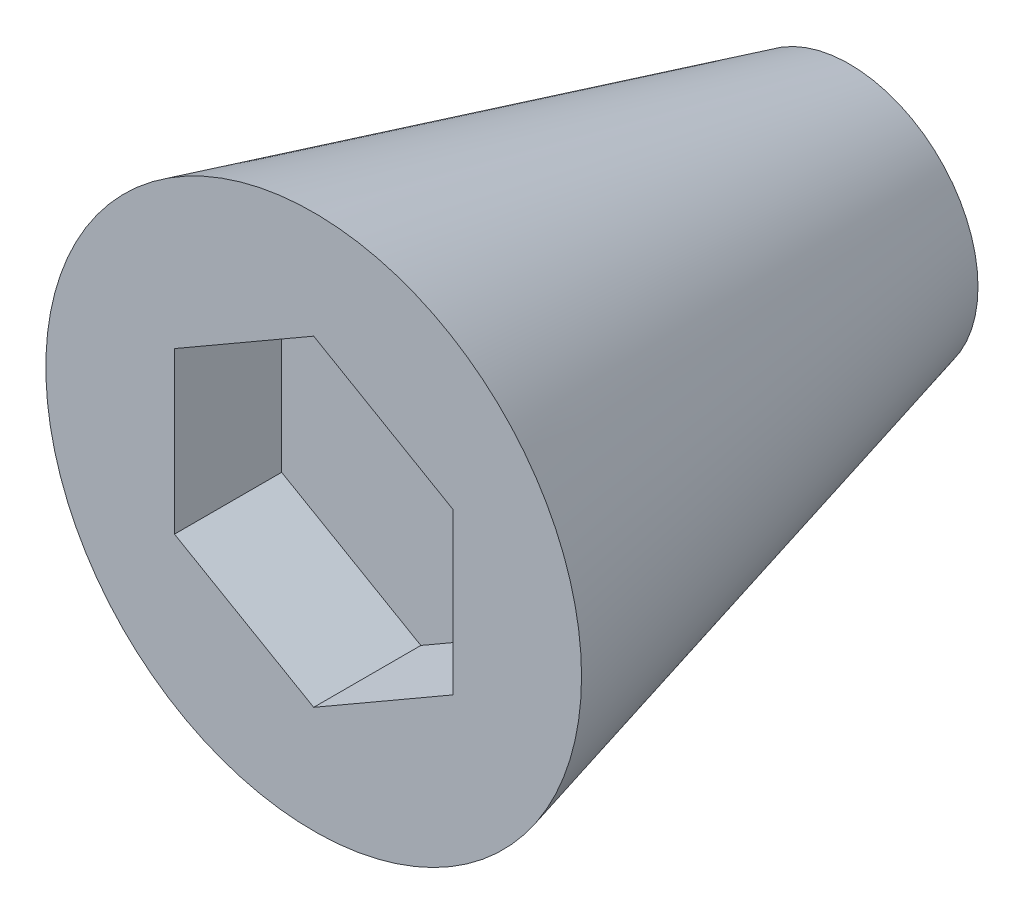
ISO-10303-21;
HEADER;
FILE_DESCRIPTION(('STEP AP214'),'2;1');
FILE_NAME('part.step','',(''),(''),'','','');
FILE_SCHEMA(('AUTOMOTIVE_DESIGN { 1 0 10303 214 1 1 1 1 }'));
ENDSEC;
DATA;
#1=APPLICATION_CONTEXT('core data for automotive mechanical design processes');
#2=APPLICATION_PROTOCOL_DEFINITION('international standard','automotive_design',2000,#1);
#3=PRODUCT_CONTEXT('',#1,'mechanical');
#4=PRODUCT('Part','Part','',(#3));
#5=PRODUCT_RELATED_PRODUCT_CATEGORY('part','',(#4));
#6=PRODUCT_DEFINITION_FORMATION('','',#4);
#7=PRODUCT_DEFINITION_CONTEXT('part definition',#1,'design');
#8=PRODUCT_DEFINITION('design','',#6,#7);
#9=PRODUCT_DEFINITION_SHAPE('','',#8);
#10=(LENGTH_UNIT() NAMED_UNIT(*) SI_UNIT(.MILLI.,.METRE.));
#11=(NAMED_UNIT(*) PLANE_ANGLE_UNIT() SI_UNIT($,.RADIAN.));
#12=(NAMED_UNIT(*) SI_UNIT($,.STERADIAN.) SOLID_ANGLE_UNIT());
#13=UNCERTAINTY_MEASURE_WITH_UNIT(LENGTH_MEASURE(1.E-05),#10,'distance_accuracy_value','');
#14=(GEOMETRIC_REPRESENTATION_CONTEXT(3) GLOBAL_UNCERTAINTY_ASSIGNED_CONTEXT((#13)) GLOBAL_UNIT_ASSIGNED_CONTEXT((#10,
#11,#12)) REPRESENTATION_CONTEXT('',''));
#15=CARTESIAN_POINT('',(0.,0.,0.));
#16=DIRECTION('',(0.,0.,1.));
#17=DIRECTION('',(1.,0.,0.));
#18=AXIS2_PLACEMENT_3D('',#15,#16,#17);
#19=CARTESIAN_POINT('',(0.,0.,0.));
#20=DIRECTION('',(0.,0.,-1.));
#21=DIRECTION('',(-1.,0.,0.));
#22=AXIS2_PLACEMENT_3D('',#19,#20,#21);
#23=PLANE('',#22);
#24=DIRECTION('',(-0.866025403784439,-0.5,0.));
#25=VECTOR('',#24,1.);
#26=CARTESIAN_POINT('',(0.,15.,0.));
#27=LINE('',#26,#25);
#28=CARTESIAN_POINT('',(0.,15.,0.));
#29=VERTEX_POINT('',#28);
#30=CARTESIAN_POINT('',(-12.9903810567666,7.5,0.));
#31=VERTEX_POINT('',#30);
#32=EDGE_CURVE('E169',#29,#31,#27,.T.);
#33=ORIENTED_EDGE('',*,*,#32,.F.);
#34=DIRECTION('',(-0.866025403784439,0.5,0.));
#35=VECTOR('',#34,1.);
#36=CARTESIAN_POINT('',(12.9903810567666,7.50000000000001,0.));
#37=LINE('',#36,#35);
#38=CARTESIAN_POINT('',(12.9903810567666,7.50000000000001,0.));
#39=VERTEX_POINT('',#38);
#40=EDGE_CURVE('E60',#39,#29,#37,.T.);
#41=ORIENTED_EDGE('',*,*,#40,.F.);
#42=DIRECTION('',(0.,1.,0.));
#43=VECTOR('',#42,1.);
#44=CARTESIAN_POINT('',(12.9903810567666,-7.50000000000001,0.));
#45=LINE('',#44,#43);
#46=CARTESIAN_POINT('',(12.9903810567666,-7.50000000000001,0.));
#47=VERTEX_POINT('',#46);
#48=EDGE_CURVE('E155',#47,#39,#45,.T.);
#49=ORIENTED_EDGE('',*,*,#48,.F.);
#50=DIRECTION('',(0.866025403784439,0.5,0.));
#51=VECTOR('',#50,1.);
#52=CARTESIAN_POINT('',(0.,-15.,0.));
#53=LINE('',#52,#51);
#54=CARTESIAN_POINT('',(0.,-15.,0.));
#55=VERTEX_POINT('',#54);
#56=EDGE_CURVE('E158',#55,#47,#53,.T.);
#57=ORIENTED_EDGE('',*,*,#56,.F.);
#58=DIRECTION('',(0.866025403784439,-0.5,0.));
#59=VECTOR('',#58,1.);
#60=CARTESIAN_POINT('',(-12.9903810567666,-7.5,0.));
#61=LINE('',#60,#59);
#62=CARTESIAN_POINT('',(-12.9903810567666,-7.5,0.));
#63=VERTEX_POINT('',#62);
#64=EDGE_CURVE('E174',#63,#55,#61,.T.);
#65=ORIENTED_EDGE('',*,*,#64,.F.);
#66=DIRECTION('',(0.,-1.,0.));
#67=VECTOR('',#66,1.);
#68=CARTESIAN_POINT('',(-12.9903810567666,7.5,0.));
#69=LINE('',#68,#67);
#70=EDGE_CURVE('E171',#31,#63,#69,.T.);
#71=ORIENTED_EDGE('',*,*,#70,.F.);
#72=EDGE_LOOP('',(#33,#41,#49,#57,#65,#71));
#73=FACE_BOUND('',#72,.T.);
#74=CARTESIAN_POINT('',(0.,0.,0.));
#75=DIRECTION('',(0.,0.,1.));
#76=DIRECTION('',(1.,0.,0.));
#77=AXIS2_PLACEMENT_3D('',#74,#75,#76);
#78=CIRCLE('',#77,25.);
#79=CARTESIAN_POINT('',(25.,0.,0.));
#80=VERTEX_POINT('',#79);
#81=EDGE_CURVE('E11',#80,#80,#78,.T.);
#82=ORIENTED_EDGE('',*,*,#81,.T.);
#83=EDGE_LOOP('',(#82));
#84=FACE_BOUND('',#83,.T.);
#85=ADVANCED_FACE('F46',(#73,#84),#23,.F.);
#86=CARTESIAN_POINT('',(0.,0.,-50.));
#87=DIRECTION('',(0.,0.,1.));
#88=DIRECTION('',(1.,0.,0.));
#89=AXIS2_PLACEMENT_3D('',#86,#87,#88);
#90=CONICAL_SURFACE('',#89,12.,0.254368058553266);
#91=ORIENTED_EDGE('',*,*,#81,.F.);
#92=EDGE_LOOP('',(#91));
#93=FACE_BOUND('',#92,.T.);
#94=CARTESIAN_POINT('',(0.,0.,-50.));
#95=DIRECTION('',(0.,0.,1.));
#96=DIRECTION('',(1.,0.,0.));
#97=AXIS2_PLACEMENT_3D('',#94,#95,#96);
#98=CIRCLE('',#97,12.);
#99=CARTESIAN_POINT('',(12.,0.,-50.));
#100=VERTEX_POINT('',#99);
#101=EDGE_CURVE('E53',#100,#100,#98,.T.);
#102=ORIENTED_EDGE('',*,*,#101,.T.);
#103=EDGE_LOOP('',(#102));
#104=FACE_BOUND('',#103,.T.);
#105=ADVANCED_FACE('F236',(#93,#104),#90,.T.);
#106=CARTESIAN_POINT('',(0.,0.,-50.));
#107=DIRECTION('',(0.,0.,1.));
#108=DIRECTION('',(1.,0.,0.));
#109=AXIS2_PLACEMENT_3D('',#106,#107,#108);
#110=PLANE('',#109);
#111=DIRECTION('',(0.866025403784439,-0.5,0.));
#112=VECTOR('',#111,1.);
#113=CARTESIAN_POINT('',(0.,6.92820323027551,-50.));
#114=LINE('',#113,#112);
#115=CARTESIAN_POINT('',(0.,6.92820323027551,-50.));
#116=VERTEX_POINT('',#115);
#117=CARTESIAN_POINT('',(6.,3.46410161513776,-50.));
#118=VERTEX_POINT('',#117);
#119=EDGE_CURVE('E209',#116,#118,#114,.T.);
#120=ORIENTED_EDGE('',*,*,#119,.F.);
#121=DIRECTION('',(0.866025403784439,0.5,0.));
#122=VECTOR('',#121,1.);
#123=CARTESIAN_POINT('',(-6.,3.46410161513776,-50.));
#124=LINE('',#123,#122);
#125=CARTESIAN_POINT('',(-6.,3.46410161513776,-50.));
#126=VERTEX_POINT('',#125);
#127=EDGE_CURVE('E68',#126,#116,#124,.T.);
#128=ORIENTED_EDGE('',*,*,#127,.F.);
#129=DIRECTION('',(0.,1.,0.));
#130=VECTOR('',#129,1.);
#131=CARTESIAN_POINT('',(-6.,-3.46410161513776,-50.));
#132=LINE('',#131,#130);
#133=CARTESIAN_POINT('',(-6.,-3.46410161513776,-50.));
#134=VERTEX_POINT('',#133);
#135=EDGE_CURVE('E192',#134,#126,#132,.T.);
#136=ORIENTED_EDGE('',*,*,#135,.F.);
#137=DIRECTION('',(-0.866025403784439,0.5,0.));
#138=VECTOR('',#137,1.);
#139=CARTESIAN_POINT('',(0.,-6.92820323027551,-50.));
#140=LINE('',#139,#138);
#141=CARTESIAN_POINT('',(0.,-6.92820323027551,-50.));
#142=VERTEX_POINT('',#141);
#143=EDGE_CURVE('E218',#142,#134,#140,.T.);
#144=ORIENTED_EDGE('',*,*,#143,.F.);
#145=DIRECTION('',(-0.866025403784439,-0.5,0.));
#146=VECTOR('',#145,1.);
#147=CARTESIAN_POINT('',(6.,-3.46410161513775,-50.));
#148=LINE('',#147,#146);
#149=CARTESIAN_POINT('',(6.,-3.46410161513775,-50.));
#150=VERTEX_POINT('',#149);
#151=EDGE_CURVE('E215',#150,#142,#148,.T.);
#152=ORIENTED_EDGE('',*,*,#151,.F.);
#153=DIRECTION('',(0.,-1.,0.));
#154=VECTOR('',#153,1.);
#155=CARTESIAN_POINT('',(6.,3.46410161513776,-50.));
#156=LINE('',#155,#154);
#157=EDGE_CURVE('E212',#118,#150,#156,.T.);
#158=ORIENTED_EDGE('',*,*,#157,.F.);
#159=EDGE_LOOP('',(#120,#128,#136,#144,#152,#158));
#160=FACE_BOUND('',#159,.T.);
#161=ORIENTED_EDGE('',*,*,#101,.F.);
#162=EDGE_LOOP('',(#161));
#163=FACE_BOUND('',#162,.T.);
#164=ADVANCED_FACE('F238',(#160,#163),#110,.F.);
#165=CARTESIAN_POINT('',(-6.,3.46410161513776,-45.));
#166=DIRECTION('',(-0.5,0.866025403784439,0.));
#167=DIRECTION('',(-0.866025403784439,-0.5,0.));
#168=AXIS2_PLACEMENT_3D('',#165,#166,#167);
#169=PLANE('',#168);
#170=ORIENTED_EDGE('',*,*,#127,.T.);
#171=DIRECTION('',(0.,0.,-1.));
#172=VECTOR('',#171,1.);
#173=CARTESIAN_POINT('',(0.,6.92820323027551,-45.));
#174=LINE('',#173,#172);
#175=CARTESIAN_POINT('',(0.,6.92820323027551,-45.));
#176=VERTEX_POINT('',#175);
#177=EDGE_CURVE('E207',#176,#116,#174,.T.);
#178=ORIENTED_EDGE('',*,*,#177,.F.);
#179=DIRECTION('',(0.866025403784439,0.5,0.));
#180=VECTOR('',#179,1.);
#181=CARTESIAN_POINT('',(-6.,3.46410161513776,-45.));
#182=LINE('',#181,#180);
#183=CARTESIAN_POINT('',(-6.,3.46410161513776,-45.));
#184=VERTEX_POINT('',#183);
#185=EDGE_CURVE('E188',#184,#176,#182,.T.);
#186=ORIENTED_EDGE('',*,*,#185,.F.);
#187=DIRECTION('',(0.,0.,-1.));
#188=VECTOR('',#187,1.);
#189=CARTESIAN_POINT('',(-6.,3.46410161513776,-45.));
#190=LINE('',#189,#188);
#191=EDGE_CURVE('E223',#184,#126,#190,.T.);
#192=ORIENTED_EDGE('',*,*,#191,.T.);
#193=EDGE_LOOP('',(#170,#178,#186,#192));
#194=FACE_BOUND('',#193,.T.);
#195=ADVANCED_FACE('F240',(#194),#169,.F.);
#196=CARTESIAN_POINT('',(-6.,-3.46410161513776,-45.));
#197=DIRECTION('',(-1.,0.,0.));
#198=DIRECTION('',(0.,0.,1.));
#199=AXIS2_PLACEMENT_3D('',#196,#197,#198);
#200=PLANE('',#199);
#201=ORIENTED_EDGE('',*,*,#135,.T.);
#202=ORIENTED_EDGE('',*,*,#191,.F.);
#203=DIRECTION('',(0.,1.,0.));
#204=VECTOR('',#203,1.);
#205=CARTESIAN_POINT('',(-6.,-3.46410161513776,-45.));
#206=LINE('',#205,#204);
#207=CARTESIAN_POINT('',(-6.,-3.46410161513776,-45.));
#208=VERTEX_POINT('',#207);
#209=EDGE_CURVE('E204',#208,#184,#206,.T.);
#210=ORIENTED_EDGE('',*,*,#209,.F.);
#211=DIRECTION('',(0.,0.,-1.));
#212=VECTOR('',#211,1.);
#213=CARTESIAN_POINT('',(-6.,-3.46410161513776,-45.));
#214=LINE('',#213,#212);
#215=EDGE_CURVE('E225',#208,#134,#214,.T.);
#216=ORIENTED_EDGE('',*,*,#215,.T.);
#217=EDGE_LOOP('',(#201,#202,#210,#216));
#218=FACE_BOUND('',#217,.T.);
#219=ADVANCED_FACE('F247',(#218),#200,.F.);
#220=CARTESIAN_POINT('',(0.,-6.92820323027551,-45.));
#221=DIRECTION('',(-0.5,-0.866025403784439,0.));
#222=DIRECTION('',(0.866025403784439,-0.5,0.));
#223=AXIS2_PLACEMENT_3D('',#220,#221,#222);
#224=PLANE('',#223);
#225=ORIENTED_EDGE('',*,*,#143,.T.);
#226=ORIENTED_EDGE('',*,*,#215,.F.);
#227=DIRECTION('',(-0.866025403784439,0.5,0.));
#228=VECTOR('',#227,1.);
#229=CARTESIAN_POINT('',(0.,-6.92820323027551,-45.));
#230=LINE('',#229,#228);
#231=CARTESIAN_POINT('',(0.,-6.92820323027551,-45.));
#232=VERTEX_POINT('',#231);
#233=EDGE_CURVE('E201',#232,#208,#230,.T.);
#234=ORIENTED_EDGE('',*,*,#233,.F.);
#235=DIRECTION('',(0.,0.,-1.));
#236=VECTOR('',#235,1.);
#237=CARTESIAN_POINT('',(0.,-6.92820323027551,-45.));
#238=LINE('',#237,#236);
#239=EDGE_CURVE('E227',#232,#142,#238,.T.);
#240=ORIENTED_EDGE('',*,*,#239,.T.);
#241=EDGE_LOOP('',(#225,#226,#234,#240));
#242=FACE_BOUND('',#241,.T.);
#243=ADVANCED_FACE('F295',(#242),#224,.F.);
#244=CARTESIAN_POINT('',(6.,-3.46410161513775,-45.));
#245=DIRECTION('',(0.5,-0.866025403784439,0.));
#246=DIRECTION('',(0.866025403784439,0.5,0.));
#247=AXIS2_PLACEMENT_3D('',#244,#245,#246);
#248=PLANE('',#247);
#249=ORIENTED_EDGE('',*,*,#151,.T.);
#250=ORIENTED_EDGE('',*,*,#239,.F.);
#251=DIRECTION('',(-0.866025403784439,-0.5,0.));
#252=VECTOR('',#251,1.);
#253=CARTESIAN_POINT('',(6.,-3.46410161513775,-45.));
#254=LINE('',#253,#252);
#255=CARTESIAN_POINT('',(6.,-3.46410161513775,-45.));
#256=VERTEX_POINT('',#255);
#257=EDGE_CURVE('E198',#256,#232,#254,.T.);
#258=ORIENTED_EDGE('',*,*,#257,.F.);
#259=DIRECTION('',(0.,0.,-1.));
#260=VECTOR('',#259,1.);
#261=CARTESIAN_POINT('',(6.,-3.46410161513775,-45.));
#262=LINE('',#261,#260);
#263=EDGE_CURVE('E229',#256,#150,#262,.T.);
#264=ORIENTED_EDGE('',*,*,#263,.T.);
#265=EDGE_LOOP('',(#249,#250,#258,#264));
#266=FACE_BOUND('',#265,.T.);
#267=ADVANCED_FACE('F299',(#266),#248,.F.);
#268=CARTESIAN_POINT('',(6.,3.46410161513776,-45.));
#269=DIRECTION('',(1.,0.,0.));
#270=DIRECTION('',(0.,1.,0.));
#271=AXIS2_PLACEMENT_3D('',#268,#269,#270);
#272=PLANE('',#271);
#273=ORIENTED_EDGE('',*,*,#157,.T.);
#274=ORIENTED_EDGE('',*,*,#263,.F.);
#275=DIRECTION('',(0.,-1.,0.));
#276=VECTOR('',#275,1.);
#277=CARTESIAN_POINT('',(6.,3.46410161513776,-45.));
#278=LINE('',#277,#276);
#279=CARTESIAN_POINT('',(6.,3.46410161513776,-45.));
#280=VERTEX_POINT('',#279);
#281=EDGE_CURVE('E195',#280,#256,#278,.T.);
#282=ORIENTED_EDGE('',*,*,#281,.F.);
#283=DIRECTION('',(0.,0.,-1.));
#284=VECTOR('',#283,1.);
#285=CARTESIAN_POINT('',(6.,3.46410161513776,-45.));
#286=LINE('',#285,#284);
#287=EDGE_CURVE('E231',#280,#118,#286,.T.);
#288=ORIENTED_EDGE('',*,*,#287,.T.);
#289=EDGE_LOOP('',(#273,#274,#282,#288));
#290=FACE_BOUND('',#289,.T.);
#291=ADVANCED_FACE('F303',(#290),#272,.F.);
#292=CARTESIAN_POINT('',(0.,6.92820323027551,-45.));
#293=DIRECTION('',(0.5,0.866025403784439,0.));
#294=DIRECTION('',(-0.866025403784439,0.5,0.));
#295=AXIS2_PLACEMENT_3D('',#292,#293,#294);
#296=PLANE('',#295);
#297=ORIENTED_EDGE('',*,*,#119,.T.);
#298=ORIENTED_EDGE('',*,*,#287,.F.);
#299=DIRECTION('',(0.866025403784439,-0.5,0.));
#300=VECTOR('',#299,1.);
#301=CARTESIAN_POINT('',(0.,6.92820323027551,-45.));
#302=LINE('',#301,#300);
#303=EDGE_CURVE('E191',#176,#280,#302,.T.);
#304=ORIENTED_EDGE('',*,*,#303,.F.);
#305=ORIENTED_EDGE('',*,*,#177,.T.);
#306=EDGE_LOOP('',(#297,#298,#304,#305));
#307=FACE_BOUND('',#306,.T.);
#308=ADVANCED_FACE('F291',(#307),#296,.F.);
#309=CARTESIAN_POINT('',(0.,0.,-45.));
#310=DIRECTION('',(0.,0.,-1.));
#311=DIRECTION('',(-1.,0.,0.));
#312=AXIS2_PLACEMENT_3D('',#309,#310,#311);
#313=PLANE('',#312);
#314=ORIENTED_EDGE('',*,*,#185,.T.);
#315=ORIENTED_EDGE('',*,*,#303,.T.);
#316=ORIENTED_EDGE('',*,*,#281,.T.);
#317=ORIENTED_EDGE('',*,*,#257,.T.);
#318=ORIENTED_EDGE('',*,*,#233,.T.);
#319=ORIENTED_EDGE('',*,*,#209,.T.);
#320=EDGE_LOOP('',(#314,#315,#316,#317,#318,#319));
#321=FACE_BOUND('',#320,.T.);
#322=ADVANCED_FACE('F280',(#321),#313,.T.);
#323=CARTESIAN_POINT('',(12.9903810567666,7.50000000000001,-10.));
#324=DIRECTION('',(0.5,0.866025403784439,0.));
#325=DIRECTION('',(-0.866025403784439,0.5,0.));
#326=AXIS2_PLACEMENT_3D('',#323,#324,#325);
#327=PLANE('',#326);
#328=ORIENTED_EDGE('',*,*,#40,.T.);
#329=DIRECTION('',(0.,0.,1.));
#330=VECTOR('',#329,1.);
#331=CARTESIAN_POINT('',(0.,15.,-10.));
#332=LINE('',#331,#330);
#333=CARTESIAN_POINT('',(0.,15.,-10.));
#334=VERTEX_POINT('',#333);
#335=EDGE_CURVE('E132',#334,#29,#332,.T.);
#336=ORIENTED_EDGE('',*,*,#335,.F.);
#337=DIRECTION('',(-0.866025403784439,0.5,0.));
#338=VECTOR('',#337,1.);
#339=CARTESIAN_POINT('',(12.9903810567666,7.50000000000001,-10.));
#340=LINE('',#339,#338);
#341=CARTESIAN_POINT('',(12.9903810567666,7.50000000000001,-10.));
#342=VERTEX_POINT('',#341);
#343=EDGE_CURVE('E136',#342,#334,#340,.T.);
#344=ORIENTED_EDGE('',*,*,#343,.F.);
#345=DIRECTION('',(0.,0.,1.));
#346=VECTOR('',#345,1.);
#347=CARTESIAN_POINT('',(12.9903810567666,7.50000000000001,-10.));
#348=LINE('',#347,#346);
#349=EDGE_CURVE('E179',#342,#39,#348,.T.);
#350=ORIENTED_EDGE('',*,*,#349,.T.);
#351=EDGE_LOOP('',(#328,#336,#344,#350));
#352=FACE_BOUND('',#351,.T.);
#353=ADVANCED_FACE('F134',(#352),#327,.F.);
#354=CARTESIAN_POINT('',(12.9903810567666,-7.50000000000001,-10.));
#355=DIRECTION('',(1.,0.,0.));
#356=DIRECTION('',(0.,1.,0.));
#357=AXIS2_PLACEMENT_3D('',#354,#355,#356);
#358=PLANE('',#357);
#359=ORIENTED_EDGE('',*,*,#48,.T.);
#360=ORIENTED_EDGE('',*,*,#349,.F.);
#361=DIRECTION('',(0.,1.,0.));
#362=VECTOR('',#361,1.);
#363=CARTESIAN_POINT('',(12.9903810567666,-7.50000000000001,-10.));
#364=LINE('',#363,#362);
#365=CARTESIAN_POINT('',(12.9903810567666,-7.50000000000001,-10.));
#366=VERTEX_POINT('',#365);
#367=EDGE_CURVE('E142',#366,#342,#364,.T.);
#368=ORIENTED_EDGE('',*,*,#367,.F.);
#369=DIRECTION('',(0.,0.,1.));
#370=VECTOR('',#369,1.);
#371=CARTESIAN_POINT('',(12.9903810567666,-7.50000000000001,-10.));
#372=LINE('',#371,#370);
#373=EDGE_CURVE('E181',#366,#47,#372,.T.);
#374=ORIENTED_EDGE('',*,*,#373,.T.);
#375=EDGE_LOOP('',(#359,#360,#368,#374));
#376=FACE_BOUND('',#375,.T.);
#377=ADVANCED_FACE('F273',(#376),#358,.F.);
#378=CARTESIAN_POINT('',(0.,-15.,-10.));
#379=DIRECTION('',(0.5,-0.866025403784439,0.));
#380=DIRECTION('',(0.866025403784439,0.5,0.));
#381=AXIS2_PLACEMENT_3D('',#378,#379,#380);
#382=PLANE('',#381);
#383=ORIENTED_EDGE('',*,*,#56,.T.);
#384=ORIENTED_EDGE('',*,*,#373,.F.);
#385=DIRECTION('',(0.866025403784439,0.5,0.));
#386=VECTOR('',#385,1.);
#387=CARTESIAN_POINT('',(0.,-15.,-10.));
#388=LINE('',#387,#386);
#389=CARTESIAN_POINT('',(0.,-15.,-10.));
#390=VERTEX_POINT('',#389);
#391=EDGE_CURVE('E165',#390,#366,#388,.T.);
#392=ORIENTED_EDGE('',*,*,#391,.F.);
#393=DIRECTION('',(0.,0.,1.));
#394=VECTOR('',#393,1.);
#395=CARTESIAN_POINT('',(0.,-15.,-10.));
#396=LINE('',#395,#394);
#397=EDGE_CURVE('E183',#390,#55,#396,.T.);
#398=ORIENTED_EDGE('',*,*,#397,.T.);
#399=EDGE_LOOP('',(#383,#384,#392,#398));
#400=FACE_BOUND('',#399,.T.);
#401=ADVANCED_FACE('F271',(#400),#382,.F.);
#402=CARTESIAN_POINT('',(-12.9903810567666,-7.5,-10.));
#403=DIRECTION('',(-0.5,-0.866025403784439,0.));
#404=DIRECTION('',(0.866025403784439,-0.5,0.));
#405=AXIS2_PLACEMENT_3D('',#402,#403,#404);
#406=PLANE('',#405);
#407=ORIENTED_EDGE('',*,*,#64,.T.);
#408=ORIENTED_EDGE('',*,*,#397,.F.);
#409=DIRECTION('',(0.866025403784439,-0.5,0.));
#410=VECTOR('',#409,1.);
#411=CARTESIAN_POINT('',(-12.9903810567666,-7.5,-10.));
#412=LINE('',#411,#410);
#413=CARTESIAN_POINT('',(-12.9903810567666,-7.5,-10.));
#414=VERTEX_POINT('',#413);
#415=EDGE_CURVE('E162',#414,#390,#412,.T.);
#416=ORIENTED_EDGE('',*,*,#415,.F.);
#417=DIRECTION('',(0.,0.,1.));
#418=VECTOR('',#417,1.);
#419=CARTESIAN_POINT('',(-12.9903810567666,-7.5,-10.));
#420=LINE('',#419,#418);
#421=EDGE_CURVE('E185',#414,#63,#420,.T.);
#422=ORIENTED_EDGE('',*,*,#421,.T.);
#423=EDGE_LOOP('',(#407,#408,#416,#422));
#424=FACE_BOUND('',#423,.T.);
#425=ADVANCED_FACE('F269',(#424),#406,.F.);
#426=CARTESIAN_POINT('',(-12.9903810567666,7.5,-10.));
#427=DIRECTION('',(-1.,0.,0.));
#428=DIRECTION('',(0.,0.,1.));
#429=AXIS2_PLACEMENT_3D('',#426,#427,#428);
#430=PLANE('',#429);
#431=ORIENTED_EDGE('',*,*,#70,.T.);
#432=ORIENTED_EDGE('',*,*,#421,.F.);
#433=DIRECTION('',(0.,-1.,0.));
#434=VECTOR('',#433,1.);
#435=CARTESIAN_POINT('',(-12.9903810567666,7.5,-10.));
#436=LINE('',#435,#434);
#437=CARTESIAN_POINT('',(-12.9903810567666,7.5,-10.));
#438=VERTEX_POINT('',#437);
#439=EDGE_CURVE('E150',#438,#414,#436,.T.);
#440=ORIENTED_EDGE('',*,*,#439,.F.);
#441=DIRECTION('',(0.,0.,1.));
#442=VECTOR('',#441,1.);
#443=CARTESIAN_POINT('',(-12.9903810567666,7.5,-10.));
#444=LINE('',#443,#442);
#445=EDGE_CURVE('E141',#438,#31,#444,.T.);
#446=ORIENTED_EDGE('',*,*,#445,.T.);
#447=EDGE_LOOP('',(#431,#432,#440,#446));
#448=FACE_BOUND('',#447,.T.);
#449=ADVANCED_FACE('F265',(#448),#430,.F.);
#450=CARTESIAN_POINT('',(0.,15.,-10.));
#451=DIRECTION('',(-0.5,0.866025403784439,0.));
#452=DIRECTION('',(-0.866025403784439,-0.5,0.));
#453=AXIS2_PLACEMENT_3D('',#450,#451,#452);
#454=PLANE('',#453);
#455=ORIENTED_EDGE('',*,*,#32,.T.);
#456=ORIENTED_EDGE('',*,*,#445,.F.);
#457=DIRECTION('',(-0.866025403784439,-0.5,0.));
#458=VECTOR('',#457,1.);
#459=CARTESIAN_POINT('',(0.,15.,-10.));
#460=LINE('',#459,#458);
#461=EDGE_CURVE('E145',#334,#438,#460,.T.);
#462=ORIENTED_EDGE('',*,*,#461,.F.);
#463=ORIENTED_EDGE('',*,*,#335,.T.);
#464=EDGE_LOOP('',(#455,#456,#462,#463));
#465=FACE_BOUND('',#464,.T.);
#466=ADVANCED_FACE('F146',(#465),#454,.F.);
#467=CARTESIAN_POINT('',(0.,0.,-10.));
#468=DIRECTION('',(0.,0.,1.));
#469=DIRECTION('',(1.,0.,0.));
#470=AXIS2_PLACEMENT_3D('',#467,#468,#469);
#471=PLANE('',#470);
#472=ORIENTED_EDGE('',*,*,#343,.T.);
#473=ORIENTED_EDGE('',*,*,#461,.T.);
#474=ORIENTED_EDGE('',*,*,#439,.T.);
#475=ORIENTED_EDGE('',*,*,#415,.T.);
#476=ORIENTED_EDGE('',*,*,#391,.T.);
#477=ORIENTED_EDGE('',*,*,#367,.T.);
#478=EDGE_LOOP('',(#472,#473,#474,#475,#476,#477));
#479=FACE_BOUND('',#478,.T.);
#480=ADVANCED_FACE('F152',(#479),#471,.T.);
#481=CLOSED_SHELL('',(#85,#105,#164,#195,#219,#243,#267,#291,#308,#322,#353,#377,#401,#425,#449,
#466,#480));
#482=MANIFOLD_SOLID_BREP('B2',#481);
#483=ADVANCED_BREP_SHAPE_REPRESENTATION('',(#18,#482),#14);
#484=SHAPE_DEFINITION_REPRESENTATION(#9,#483);
ENDSEC;
END-ISO-10303-21;
